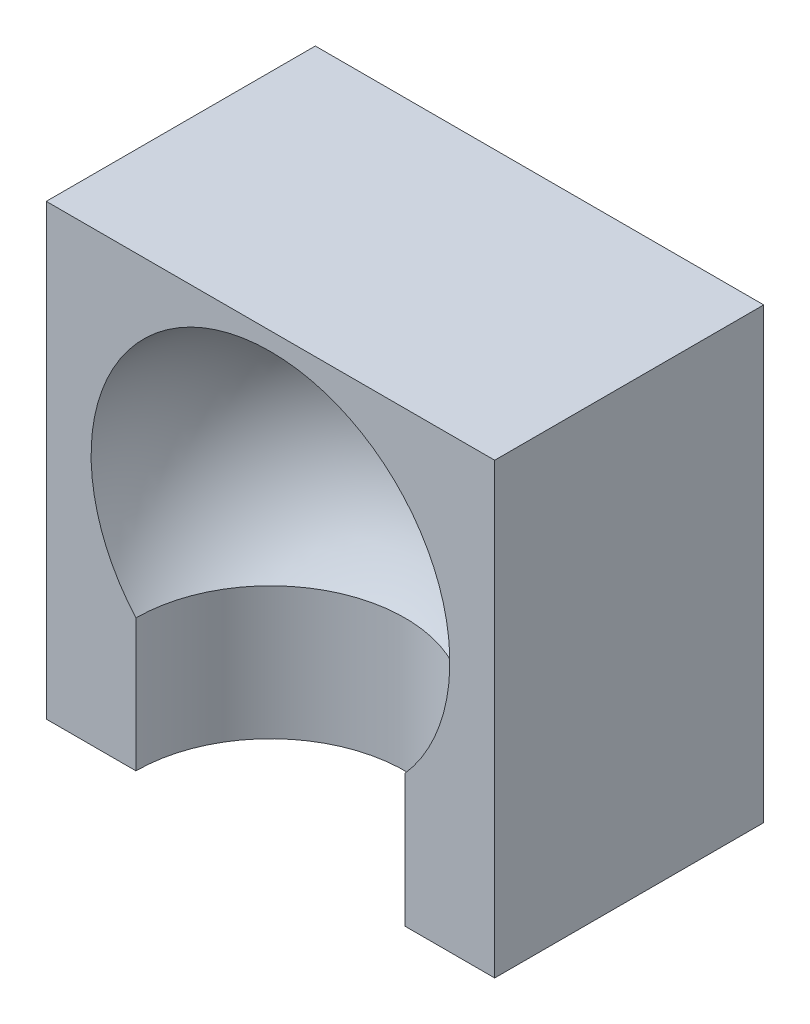
ISO-10303-21;
HEADER;
FILE_DESCRIPTION(('STEP AP214'),'2;1');
FILE_NAME('part.step','',(''),(''),'','','');
FILE_SCHEMA(('AUTOMOTIVE_DESIGN { 1 0 10303 214 1 1 1 1 }'));
ENDSEC;
DATA;
#1=APPLICATION_CONTEXT('core data for automotive mechanical design processes');
#2=APPLICATION_PROTOCOL_DEFINITION('international standard','automotive_design',2000,#1);
#3=PRODUCT_CONTEXT('',#1,'mechanical');
#4=PRODUCT('Part','Part','',(#3));
#5=PRODUCT_RELATED_PRODUCT_CATEGORY('part','',(#4));
#6=PRODUCT_DEFINITION_FORMATION('','',#4);
#7=PRODUCT_DEFINITION_CONTEXT('part definition',#1,'design');
#8=PRODUCT_DEFINITION('design','',#6,#7);
#9=PRODUCT_DEFINITION_SHAPE('','',#8);
#10=(LENGTH_UNIT() NAMED_UNIT(*) SI_UNIT(.MILLI.,.METRE.));
#11=(NAMED_UNIT(*) PLANE_ANGLE_UNIT() SI_UNIT($,.RADIAN.));
#12=(NAMED_UNIT(*) SI_UNIT($,.STERADIAN.) SOLID_ANGLE_UNIT());
#13=UNCERTAINTY_MEASURE_WITH_UNIT(LENGTH_MEASURE(1.E-05),#10,'distance_accuracy_value','');
#14=(GEOMETRIC_REPRESENTATION_CONTEXT(3) GLOBAL_UNCERTAINTY_ASSIGNED_CONTEXT((#13)) GLOBAL_UNIT_ASSIGNED_CONTEXT((#10,
#11,#12)) REPRESENTATION_CONTEXT('',''));
#15=CARTESIAN_POINT('',(0.,0.,0.));
#16=DIRECTION('',(0.,0.,1.));
#17=DIRECTION('',(1.,0.,0.));
#18=AXIS2_PLACEMENT_3D('',#15,#16,#17);
#19=CARTESIAN_POINT('',(0.,0.,15.));
#20=DIRECTION('',(1.,0.,0.));
#21=DIRECTION('',(0.,0.,-1.));
#22=AXIS2_PLACEMENT_3D('',#19,#20,#21);
#23=PLANE('',#22);
#24=DIRECTION('',(0.,-1.,0.));
#25=VECTOR('',#24,1.);
#26=CARTESIAN_POINT('',(0.,0.,0.));
#27=LINE('',#26,#25);
#28=CARTESIAN_POINT('',(0.,25.,0.));
#29=VERTEX_POINT('',#28);
#30=CARTESIAN_POINT('',(0.,0.,0.));
#31=VERTEX_POINT('',#30);
#32=EDGE_CURVE('E121',#29,#31,#27,.T.);
#33=ORIENTED_EDGE('',*,*,#32,.T.);
#34=DIRECTION('',(0.,0.,-1.));
#35=VECTOR('',#34,1.);
#36=CARTESIAN_POINT('',(0.,0.,15.));
#37=LINE('',#36,#35);
#38=CARTESIAN_POINT('',(0.,0.,15.));
#39=VERTEX_POINT('',#38);
#40=EDGE_CURVE('E44',#39,#31,#37,.T.);
#41=ORIENTED_EDGE('',*,*,#40,.F.);
#42=DIRECTION('',(0.,-1.,0.));
#43=VECTOR('',#42,1.);
#44=CARTESIAN_POINT('',(0.,0.,15.));
#45=LINE('',#44,#43);
#46=CARTESIAN_POINT('',(0.,25.,15.));
#47=VERTEX_POINT('',#46);
#48=EDGE_CURVE('E113',#47,#39,#45,.T.);
#49=ORIENTED_EDGE('',*,*,#48,.F.);
#50=DIRECTION('',(0.,0.,-1.));
#51=VECTOR('',#50,1.);
#52=CARTESIAN_POINT('',(0.,25.,15.));
#53=LINE('',#52,#51);
#54=EDGE_CURVE('E120',#47,#29,#53,.T.);
#55=ORIENTED_EDGE('',*,*,#54,.T.);
#56=EDGE_LOOP('',(#33,#41,#49,#55));
#57=FACE_BOUND('',#56,.T.);
#58=ADVANCED_FACE('F37',(#57),#23,.F.);
#59=CARTESIAN_POINT('',(0.,0.,15.));
#60=DIRECTION('',(0.,1.,0.));
#61=DIRECTION('',(0.,0.,1.));
#62=AXIS2_PLACEMENT_3D('',#59,#60,#61);
#63=PLANE('',#62);
#64=DIRECTION('',(1.,0.,0.));
#65=VECTOR('',#64,1.);
#66=CARTESIAN_POINT('',(0.,0.,15.));
#67=LINE('',#66,#65);
#68=CARTESIAN_POINT('',(20.,0.,15.));
#69=VERTEX_POINT('',#68);
#70=CARTESIAN_POINT('',(25.,0.,15.));
#71=VERTEX_POINT('',#70);
#72=EDGE_CURVE('E104',#69,#71,#67,.T.);
#73=ORIENTED_EDGE('',*,*,#72,.F.);
#74=CARTESIAN_POINT('',(12.5,0.,15.));
#75=DIRECTION('',(0.,-1.,0.));
#76=DIRECTION('',(0.,0.,-1.));
#77=AXIS2_PLACEMENT_3D('',#74,#75,#76);
#78=CIRCLE('',#77,7.5);
#79=CARTESIAN_POINT('',(5.,0.,15.));
#80=VERTEX_POINT('',#79);
#81=EDGE_CURVE('E96',#80,#69,#78,.T.);
#82=ORIENTED_EDGE('',*,*,#81,.F.);
#83=EDGE_CURVE('E88',#39,#80,#67,.T.);
#84=ORIENTED_EDGE('',*,*,#83,.F.);
#85=ORIENTED_EDGE('',*,*,#40,.T.);
#86=DIRECTION('',(1.,0.,0.));
#87=VECTOR('',#86,1.);
#88=CARTESIAN_POINT('',(0.,0.,0.));
#89=LINE('',#88,#87);
#90=CARTESIAN_POINT('',(25.,0.,0.));
#91=VERTEX_POINT('',#90);
#92=EDGE_CURVE('E124',#31,#91,#89,.T.);
#93=ORIENTED_EDGE('',*,*,#92,.T.);
#94=DIRECTION('',(0.,0.,-1.));
#95=VECTOR('',#94,1.);
#96=CARTESIAN_POINT('',(25.,0.,15.));
#97=LINE('',#96,#95);
#98=EDGE_CURVE('E111',#71,#91,#97,.T.);
#99=ORIENTED_EDGE('',*,*,#98,.F.);
#100=EDGE_LOOP('',(#73,#82,#84,#85,#93,#99));
#101=FACE_BOUND('',#100,.T.);
#102=ADVANCED_FACE('F109',(#101),#63,.F.);
#103=CARTESIAN_POINT('',(25.,0.,15.));
#104=DIRECTION('',(-1.,0.,0.));
#105=DIRECTION('',(0.,0.,1.));
#106=AXIS2_PLACEMENT_3D('',#103,#104,#105);
#107=PLANE('',#106);
#108=DIRECTION('',(0.,1.,0.));
#109=VECTOR('',#108,1.);
#110=CARTESIAN_POINT('',(25.,0.,0.));
#111=LINE('',#110,#109);
#112=CARTESIAN_POINT('',(25.,25.,0.));
#113=VERTEX_POINT('',#112);
#114=EDGE_CURVE('E126',#91,#113,#111,.T.);
#115=ORIENTED_EDGE('',*,*,#114,.T.);
#116=DIRECTION('',(0.,0.,-1.));
#117=VECTOR('',#116,1.);
#118=CARTESIAN_POINT('',(25.,25.,15.));
#119=LINE('',#118,#117);
#120=CARTESIAN_POINT('',(25.,25.,15.));
#121=VERTEX_POINT('',#120);
#122=EDGE_CURVE('E130',#121,#113,#119,.T.);
#123=ORIENTED_EDGE('',*,*,#122,.F.);
#124=DIRECTION('',(0.,1.,0.));
#125=VECTOR('',#124,1.);
#126=CARTESIAN_POINT('',(25.,0.,15.));
#127=LINE('',#126,#125);
#128=EDGE_CURVE('E115',#71,#121,#127,.T.);
#129=ORIENTED_EDGE('',*,*,#128,.F.);
#130=ORIENTED_EDGE('',*,*,#98,.T.);
#131=EDGE_LOOP('',(#115,#123,#129,#130));
#132=FACE_BOUND('',#131,.T.);
#133=ADVANCED_FACE('F143',(#132),#107,.F.);
#134=CARTESIAN_POINT('',(0.,25.,15.));
#135=DIRECTION('',(0.,-1.,0.));
#136=DIRECTION('',(0.,0.,-1.));
#137=AXIS2_PLACEMENT_3D('',#134,#135,#136);
#138=PLANE('',#137);
#139=DIRECTION('',(-1.,0.,0.));
#140=VECTOR('',#139,1.);
#141=CARTESIAN_POINT('',(0.,25.,0.));
#142=LINE('',#141,#140);
#143=EDGE_CURVE('E80',#113,#29,#142,.T.);
#144=ORIENTED_EDGE('',*,*,#143,.T.);
#145=ORIENTED_EDGE('',*,*,#54,.F.);
#146=DIRECTION('',(-1.,0.,0.));
#147=VECTOR('',#146,1.);
#148=CARTESIAN_POINT('',(0.,25.,15.));
#149=LINE('',#148,#147);
#150=EDGE_CURVE('E59',#121,#47,#149,.T.);
#151=ORIENTED_EDGE('',*,*,#150,.F.);
#152=ORIENTED_EDGE('',*,*,#122,.T.);
#153=EDGE_LOOP('',(#144,#145,#151,#152));
#154=FACE_BOUND('',#153,.T.);
#155=ADVANCED_FACE('F153',(#154),#138,.F.);
#156=CARTESIAN_POINT('',(0.,0.,15.));
#157=DIRECTION('',(0.,0.,-1.));
#158=DIRECTION('',(-1.,0.,0.));
#159=AXIS2_PLACEMENT_3D('',#156,#157,#158);
#160=PLANE('',#159);
#161=CARTESIAN_POINT('',(12.5,14.,15.));
#162=DIRECTION('',(0.,0.,-1.));
#163=DIRECTION('',(-1.,0.,0.));
#164=AXIS2_PLACEMENT_3D('',#161,#162,#163);
#165=CIRCLE('',#164,10.);
#166=CARTESIAN_POINT('',(20.,7.38562172233853,15.));
#167=VERTEX_POINT('',#166);
#168=CARTESIAN_POINT('',(5.,7.38562172233853,15.));
#169=VERTEX_POINT('',#168);
#170=EDGE_CURVE('E107',#167,#169,#165,.F.);
#171=ORIENTED_EDGE('',*,*,#170,.F.);
#172=DIRECTION('',(0.,-1.,0.));
#173=VECTOR('',#172,1.);
#174=CARTESIAN_POINT('',(20.,15.,15.));
#175=LINE('',#174,#173);
#176=EDGE_CURVE('E50',#167,#69,#175,.T.);
#177=ORIENTED_EDGE('',*,*,#176,.T.);
#178=ORIENTED_EDGE('',*,*,#72,.T.);
#179=ORIENTED_EDGE('',*,*,#128,.T.);
#180=ORIENTED_EDGE('',*,*,#150,.T.);
#181=ORIENTED_EDGE('',*,*,#48,.T.);
#182=ORIENTED_EDGE('',*,*,#83,.T.);
#183=DIRECTION('',(0.,-1.,0.));
#184=VECTOR('',#183,1.);
#185=CARTESIAN_POINT('',(5.,15.,15.));
#186=LINE('',#185,#184);
#187=EDGE_CURVE('E99',#80,#169,#186,.F.);
#188=ORIENTED_EDGE('',*,*,#187,.T.);
#189=EDGE_LOOP('',(#171,#177,#178,#179,#180,#181,#182,#188));
#190=FACE_BOUND('',#189,.T.);
#191=ADVANCED_FACE('F103',(#190),#160,.F.);
#192=CARTESIAN_POINT('',(0.,0.,0.));
#193=DIRECTION('',(0.,0.,-1.));
#194=DIRECTION('',(-1.,0.,0.));
#195=AXIS2_PLACEMENT_3D('',#192,#193,#194);
#196=PLANE('',#195);
#197=ORIENTED_EDGE('',*,*,#32,.F.);
#198=ORIENTED_EDGE('',*,*,#143,.F.);
#199=ORIENTED_EDGE('',*,*,#114,.F.);
#200=ORIENTED_EDGE('',*,*,#92,.F.);
#201=EDGE_LOOP('',(#197,#198,#199,#200));
#202=FACE_BOUND('',#201,.T.);
#203=ADVANCED_FACE('F145',(#202),#196,.T.);
#204=CARTESIAN_POINT('',(12.5,14.,15.));
#205=DIRECTION('',(0.,1.,0.));
#206=DIRECTION('',(1.,0.,0.));
#207=AXIS2_PLACEMENT_3D('',#204,#205,#206);
#208=SPHERICAL_SURFACE('',#207,10.);
#209=CARTESIAN_POINT('',(12.5,7.38562172233853,15.));
#210=DIRECTION('',(0.,1.,0.));
#211=DIRECTION('',(0.,0.,1.));
#212=AXIS2_PLACEMENT_3D('',#209,#210,#211);
#213=CIRCLE('',#212,7.5);
#214=EDGE_CURVE('E11',#167,#169,#213,.T.);
#215=ORIENTED_EDGE('',*,*,#214,.F.);
#216=ORIENTED_EDGE('',*,*,#170,.T.);
#217=EDGE_LOOP('',(#215,#216));
#218=FACE_BOUND('',#217,.T.);
#219=ADVANCED_FACE('F134',(#218),#208,.F.);
#220=CARTESIAN_POINT('',(12.5,15.,15.));
#221=DIRECTION('',(0.,-1.,0.));
#222=DIRECTION('',(0.,0.,-1.));
#223=AXIS2_PLACEMENT_3D('',#220,#221,#222);
#224=CYLINDRICAL_SURFACE('',#223,7.5);
#225=ORIENTED_EDGE('',*,*,#214,.T.);
#226=ORIENTED_EDGE('',*,*,#187,.F.);
#227=ORIENTED_EDGE('',*,*,#81,.T.);
#228=ORIENTED_EDGE('',*,*,#176,.F.);
#229=EDGE_LOOP('',(#225,#226,#227,#228));
#230=FACE_BOUND('',#229,.T.);
#231=ADVANCED_FACE('F97',(#230),#224,.F.);
#232=CLOSED_SHELL('',(#58,#102,#133,#155,#191,#203,#219,#231));
#233=MANIFOLD_SOLID_BREP('B2',#232);
#234=ADVANCED_BREP_SHAPE_REPRESENTATION('',(#18,#233),#14);
#235=SHAPE_DEFINITION_REPRESENTATION(#9,#234);
ENDSEC;
END-ISO-10303-21;
